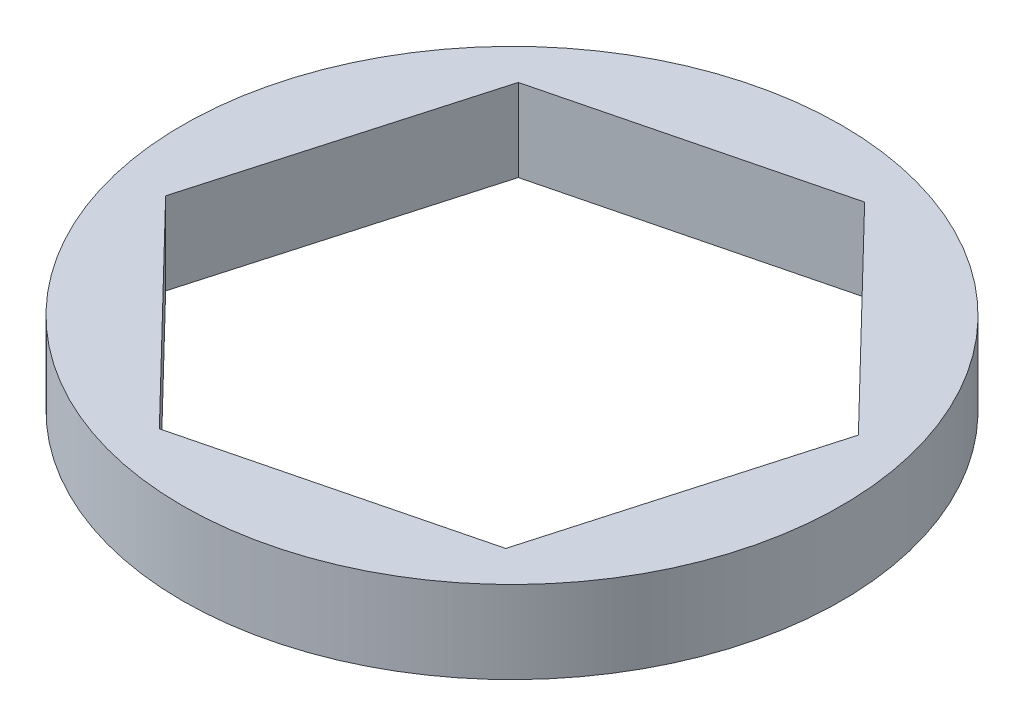
ISO-10303-21;
HEADER;
FILE_DESCRIPTION(('STEP AP214'),'2;1');
FILE_NAME('part.step','',(''),(''),'','','');
FILE_SCHEMA(('AUTOMOTIVE_DESIGN { 1 0 10303 214 1 1 1 1 }'));
ENDSEC;
DATA;
#1=APPLICATION_CONTEXT('core data for automotive mechanical design processes');
#2=APPLICATION_PROTOCOL_DEFINITION('international standard','automotive_design',2000,#1);
#3=PRODUCT_CONTEXT('',#1,'mechanical');
#4=PRODUCT('Part','Part','',(#3));
#5=PRODUCT_RELATED_PRODUCT_CATEGORY('part','',(#4));
#6=PRODUCT_DEFINITION_FORMATION('','',#4);
#7=PRODUCT_DEFINITION_CONTEXT('part definition',#1,'design');
#8=PRODUCT_DEFINITION('design','',#6,#7);
#9=PRODUCT_DEFINITION_SHAPE('','',#8);
#10=(LENGTH_UNIT() NAMED_UNIT(*) SI_UNIT(.MILLI.,.METRE.));
#11=(NAMED_UNIT(*) PLANE_ANGLE_UNIT() SI_UNIT($,.RADIAN.));
#12=(NAMED_UNIT(*) SI_UNIT($,.STERADIAN.) SOLID_ANGLE_UNIT());
#13=UNCERTAINTY_MEASURE_WITH_UNIT(LENGTH_MEASURE(1.E-05),#10,'distance_accuracy_value','');
#14=(GEOMETRIC_REPRESENTATION_CONTEXT(3) GLOBAL_UNCERTAINTY_ASSIGNED_CONTEXT((#13)) GLOBAL_UNIT_ASSIGNED_CONTEXT((#10,
#11,#12)) REPRESENTATION_CONTEXT('',''));
#15=CARTESIAN_POINT('',(0.,0.,0.));
#16=DIRECTION('',(0.,0.,1.));
#17=DIRECTION('',(1.,0.,0.));
#18=AXIS2_PLACEMENT_3D('',#15,#16,#17);
#19=CARTESIAN_POINT('',(0.,1.5875,0.));
#20=DIRECTION('',(0.,1.,0.));
#21=DIRECTION('',(0.,0.,1.));
#22=AXIS2_PLACEMENT_3D('',#19,#20,#21);
#23=PLANE('',#22);
#24=CARTESIAN_POINT('',(0.,1.5875,0.));
#25=DIRECTION('',(0.,1.,0.));
#26=DIRECTION('',(0.,0.,1.));
#27=AXIS2_PLACEMENT_3D('',#24,#25,#26);
#28=CIRCLE('',#27,6.35);
#29=CARTESIAN_POINT('',(0.,1.5875,6.35));
#30=VERTEX_POINT('',#29);
#31=EDGE_CURVE('E11',#30,#30,#28,.T.);
#32=ORIENTED_EDGE('',*,*,#31,.T.);
#33=EDGE_LOOP('',(#32));
#34=FACE_BOUND('',#33,.T.);
#35=DIRECTION('',(-0.969830096251339,0.,0.243781837726107));
#36=VECTOR('',#35,1.);
#37=CARTESIAN_POINT('',(1.50566356257848,1.5875,-5.28912584803231));
#38=LINE('',#37,#36);
#39=CARTESIAN_POINT('',(1.50566356257848,1.5875,-5.28912584803231));
#40=VERTEX_POINT('',#39);
#41=CARTESIAN_POINT('',(-3.82768556691965,1.5875,-3.9485058187617));
#42=VERTEX_POINT('',#41);
#43=EDGE_CURVE('E94',#40,#42,#38,.T.);
#44=ORIENTED_EDGE('',*,*,#43,.F.);
#45=DIRECTION('',(-0.696036312577735,0.,-0.718006581845313));
#46=VECTOR('',#45,1.);
#47=CARTESIAN_POINT('',(5.33334912949813,1.5875,-1.34062002927061));
#48=LINE('',#47,#46);
#49=CARTESIAN_POINT('',(5.33334912949813,1.5875,-1.34062002927061));
#50=VERTEX_POINT('',#49);
#51=EDGE_CURVE('E86',#50,#40,#48,.T.);
#52=ORIENTED_EDGE('',*,*,#51,.F.);
#53=DIRECTION('',(0.273793783673605,0.,-0.961788419571421));
#54=VECTOR('',#53,1.);
#55=CARTESIAN_POINT('',(3.82768556691965,1.5875,3.9485058187617));
#56=LINE('',#55,#54);
#57=CARTESIAN_POINT('',(3.82768556691965,1.5875,3.9485058187617));
#58=VERTEX_POINT('',#57);
#59=EDGE_CURVE('E114',#58,#50,#56,.T.);
#60=ORIENTED_EDGE('',*,*,#59,.F.);
#61=DIRECTION('',(0.969830096251339,0.,-0.243781837726108));
#62=VECTOR('',#61,1.);
#63=CARTESIAN_POINT('',(-1.50566356257847,1.5875,5.28912584803231));
#64=LINE('',#63,#62);
#65=CARTESIAN_POINT('',(-1.50566356257847,1.5875,5.28912584803231));
#66=VERTEX_POINT('',#65);
#67=EDGE_CURVE('E112',#66,#58,#64,.T.);
#68=ORIENTED_EDGE('',*,*,#67,.F.);
#69=DIRECTION('',(0.696036312577735,0.,0.718006581845313));
#70=VECTOR('',#69,1.);
#71=CARTESIAN_POINT('',(-5.33334912949813,1.5875,1.34062002927061));
#72=LINE('',#71,#70);
#73=CARTESIAN_POINT('',(-5.33334912949813,1.5875,1.34062002927061));
#74=VERTEX_POINT('',#73);
#75=EDGE_CURVE('E108',#74,#66,#72,.T.);
#76=ORIENTED_EDGE('',*,*,#75,.F.);
#77=DIRECTION('',(-0.273793783673604,0.,0.961788419571421));
#78=VECTOR('',#77,1.);
#79=CARTESIAN_POINT('',(-3.82768556691965,1.5875,-3.9485058187617));
#80=LINE('',#79,#78);
#81=EDGE_CURVE('E106',#42,#74,#80,.T.);
#82=ORIENTED_EDGE('',*,*,#81,.F.);
#83=EDGE_LOOP('',(#44,#52,#60,#68,#76,#82));
#84=FACE_BOUND('',#83,.T.);
#85=ADVANCED_FACE('F33',(#34,#84),#23,.T.);
#86=CARTESIAN_POINT('',(0.,0.,0.));
#87=DIRECTION('',(0.,1.,0.));
#88=DIRECTION('',(0.,0.,1.));
#89=AXIS2_PLACEMENT_3D('',#86,#87,#88);
#90=PLANE('',#89);
#91=CARTESIAN_POINT('',(0.,0.,0.));
#92=DIRECTION('',(0.,1.,0.));
#93=DIRECTION('',(0.,0.,1.));
#94=AXIS2_PLACEMENT_3D('',#91,#92,#93);
#95=CIRCLE('',#94,6.35);
#96=CARTESIAN_POINT('',(0.,0.,6.35));
#97=VERTEX_POINT('',#96);
#98=EDGE_CURVE('E37',#97,#97,#95,.T.);
#99=ORIENTED_EDGE('',*,*,#98,.F.);
#100=EDGE_LOOP('',(#99));
#101=FACE_BOUND('',#100,.T.);
#102=DIRECTION('',(-0.696036312577735,0.,-0.718006581845313));
#103=VECTOR('',#102,1.);
#104=CARTESIAN_POINT('',(5.33334912949813,0.,-1.34062002927061));
#105=LINE('',#104,#103);
#106=CARTESIAN_POINT('',(5.33334912949813,0.,-1.34062002927061));
#107=VERTEX_POINT('',#106);
#108=CARTESIAN_POINT('',(1.50566356257848,0.,-5.28912584803231));
#109=VERTEX_POINT('',#108);
#110=EDGE_CURVE('E56',#107,#109,#105,.T.);
#111=ORIENTED_EDGE('',*,*,#110,.T.);
#112=DIRECTION('',(-0.969830096251339,0.,0.243781837726107));
#113=VECTOR('',#112,1.);
#114=CARTESIAN_POINT('',(1.50566356257848,0.,-5.28912584803231));
#115=LINE('',#114,#113);
#116=CARTESIAN_POINT('',(-3.82768556691965,0.,-3.9485058187617));
#117=VERTEX_POINT('',#116);
#118=EDGE_CURVE('E101',#109,#117,#115,.T.);
#119=ORIENTED_EDGE('',*,*,#118,.T.);
#120=DIRECTION('',(-0.273793783673604,0.,0.961788419571421));
#121=VECTOR('',#120,1.);
#122=CARTESIAN_POINT('',(-3.82768556691965,0.,-3.9485058187617));
#123=LINE('',#122,#121);
#124=CARTESIAN_POINT('',(-5.33334912949813,0.,1.34062002927061));
#125=VERTEX_POINT('',#124);
#126=EDGE_CURVE('E118',#117,#125,#123,.T.);
#127=ORIENTED_EDGE('',*,*,#126,.T.);
#128=DIRECTION('',(0.696036312577735,0.,0.718006581845313));
#129=VECTOR('',#128,1.);
#130=CARTESIAN_POINT('',(-5.33334912949813,0.,1.34062002927061));
#131=LINE('',#130,#129);
#132=CARTESIAN_POINT('',(-1.50566356257847,0.,5.28912584803231));
#133=VERTEX_POINT('',#132);
#134=EDGE_CURVE('E121',#125,#133,#131,.T.);
#135=ORIENTED_EDGE('',*,*,#134,.T.);
#136=DIRECTION('',(0.969830096251339,0.,-0.243781837726108));
#137=VECTOR('',#136,1.);
#138=CARTESIAN_POINT('',(-1.50566356257847,0.,5.28912584803231));
#139=LINE('',#138,#137);
#140=CARTESIAN_POINT('',(3.82768556691965,0.,3.9485058187617));
#141=VERTEX_POINT('',#140);
#142=EDGE_CURVE('E124',#133,#141,#139,.T.);
#143=ORIENTED_EDGE('',*,*,#142,.T.);
#144=DIRECTION('',(0.273793783673605,0.,-0.961788419571421));
#145=VECTOR('',#144,1.);
#146=CARTESIAN_POINT('',(3.82768556691965,0.,3.9485058187617));
#147=LINE('',#146,#145);
#148=EDGE_CURVE('E95',#141,#107,#147,.T.);
#149=ORIENTED_EDGE('',*,*,#148,.T.);
#150=EDGE_LOOP('',(#111,#119,#127,#135,#143,#149));
#151=FACE_BOUND('',#150,.T.);
#152=ADVANCED_FACE('F141',(#101,#151),#90,.F.);
#153=CARTESIAN_POINT('',(0.,1.5875,0.));
#154=DIRECTION('',(0.,-1.,0.));
#155=DIRECTION('',(0.,0.,-1.));
#156=AXIS2_PLACEMENT_3D('',#153,#154,#155);
#157=CYLINDRICAL_SURFACE('',#156,6.35);
#158=ORIENTED_EDGE('',*,*,#31,.F.);
#159=EDGE_LOOP('',(#158));
#160=FACE_BOUND('',#159,.T.);
#161=ORIENTED_EDGE('',*,*,#98,.T.);
#162=EDGE_LOOP('',(#161));
#163=FACE_BOUND('',#162,.T.);
#164=ADVANCED_FACE('F35',(#160,#163),#157,.T.);
#165=CARTESIAN_POINT('',(5.33334912949813,1.5875,-1.34062002927061));
#166=DIRECTION('',(-0.718006581845313,0.,0.696036312577735));
#167=DIRECTION('',(0.696036312577735,0.,0.718006581845313));
#168=AXIS2_PLACEMENT_3D('',#165,#166,#167);
#169=PLANE('',#168);
#170=ORIENTED_EDGE('',*,*,#110,.F.);
#171=DIRECTION('',(0.,-1.,0.));
#172=VECTOR('',#171,1.);
#173=CARTESIAN_POINT('',(5.33334912949813,1.5875,-1.34062002927061));
#174=LINE('',#173,#172);
#175=EDGE_CURVE('E90',#50,#107,#174,.T.);
#176=ORIENTED_EDGE('',*,*,#175,.F.);
#177=ORIENTED_EDGE('',*,*,#51,.T.);
#178=DIRECTION('',(0.,-1.,0.));
#179=VECTOR('',#178,1.);
#180=CARTESIAN_POINT('',(1.50566356257848,1.5875,-5.28912584803231));
#181=LINE('',#180,#179);
#182=EDGE_CURVE('E89',#40,#109,#181,.T.);
#183=ORIENTED_EDGE('',*,*,#182,.T.);
#184=EDGE_LOOP('',(#170,#176,#177,#183));
#185=FACE_BOUND('',#184,.T.);
#186=ADVANCED_FACE('F88',(#185),#169,.T.);
#187=CARTESIAN_POINT('',(1.50566356257848,1.5875,-5.28912584803231));
#188=DIRECTION('',(0.243781837726107,0.,0.969830096251339));
#189=DIRECTION('',(0.969830096251339,0.,-0.243781837726107));
#190=AXIS2_PLACEMENT_3D('',#187,#188,#189);
#191=PLANE('',#190);
#192=ORIENTED_EDGE('',*,*,#118,.F.);
#193=ORIENTED_EDGE('',*,*,#182,.F.);
#194=ORIENTED_EDGE('',*,*,#43,.T.);
#195=DIRECTION('',(0.,-1.,0.));
#196=VECTOR('',#195,1.);
#197=CARTESIAN_POINT('',(-3.82768556691965,1.5875,-3.9485058187617));
#198=LINE('',#197,#196);
#199=EDGE_CURVE('E102',#42,#117,#198,.T.);
#200=ORIENTED_EDGE('',*,*,#199,.T.);
#201=EDGE_LOOP('',(#192,#193,#194,#200));
#202=FACE_BOUND('',#201,.T.);
#203=ADVANCED_FACE('F98',(#202),#191,.T.);
#204=CARTESIAN_POINT('',(-3.82768556691965,1.5875,-3.9485058187617));
#205=DIRECTION('',(0.961788419571421,0.,0.273793783673604));
#206=DIRECTION('',(0.273793783673604,0.,-0.961788419571421));
#207=AXIS2_PLACEMENT_3D('',#204,#205,#206);
#208=PLANE('',#207);
#209=ORIENTED_EDGE('',*,*,#126,.F.);
#210=ORIENTED_EDGE('',*,*,#199,.F.);
#211=ORIENTED_EDGE('',*,*,#81,.T.);
#212=DIRECTION('',(0.,-1.,0.));
#213=VECTOR('',#212,1.);
#214=CARTESIAN_POINT('',(-5.33334912949813,1.5875,1.34062002927061));
#215=LINE('',#214,#213);
#216=EDGE_CURVE('E133',#74,#125,#215,.T.);
#217=ORIENTED_EDGE('',*,*,#216,.T.);
#218=EDGE_LOOP('',(#209,#210,#211,#217));
#219=FACE_BOUND('',#218,.T.);
#220=ADVANCED_FACE('F137',(#219),#208,.T.);
#221=CARTESIAN_POINT('',(-5.33334912949813,1.5875,1.34062002927061));
#222=DIRECTION('',(0.718006581845313,0.,-0.696036312577735));
#223=DIRECTION('',(-0.696036312577735,0.,-0.718006581845313));
#224=AXIS2_PLACEMENT_3D('',#221,#222,#223);
#225=PLANE('',#224);
#226=ORIENTED_EDGE('',*,*,#134,.F.);
#227=ORIENTED_EDGE('',*,*,#216,.F.);
#228=ORIENTED_EDGE('',*,*,#75,.T.);
#229=DIRECTION('',(0.,-1.,0.));
#230=VECTOR('',#229,1.);
#231=CARTESIAN_POINT('',(-1.50566356257847,1.5875,5.28912584803231));
#232=LINE('',#231,#230);
#233=EDGE_CURVE('E131',#66,#133,#232,.T.);
#234=ORIENTED_EDGE('',*,*,#233,.T.);
#235=EDGE_LOOP('',(#226,#227,#228,#234));
#236=FACE_BOUND('',#235,.T.);
#237=ADVANCED_FACE('F149',(#236),#225,.T.);
#238=CARTESIAN_POINT('',(-1.50566356257847,1.5875,5.28912584803231));
#239=DIRECTION('',(-0.243781837726108,0.,-0.969830096251339));
#240=DIRECTION('',(-0.969830096251339,0.,0.243781837726108));
#241=AXIS2_PLACEMENT_3D('',#238,#239,#240);
#242=PLANE('',#241);
#243=ORIENTED_EDGE('',*,*,#142,.F.);
#244=ORIENTED_EDGE('',*,*,#233,.F.);
#245=ORIENTED_EDGE('',*,*,#67,.T.);
#246=DIRECTION('',(0.,-1.,0.));
#247=VECTOR('',#246,1.);
#248=CARTESIAN_POINT('',(3.82768556691965,1.5875,3.9485058187617));
#249=LINE('',#248,#247);
#250=EDGE_CURVE('E48',#58,#141,#249,.T.);
#251=ORIENTED_EDGE('',*,*,#250,.T.);
#252=EDGE_LOOP('',(#243,#244,#245,#251));
#253=FACE_BOUND('',#252,.T.);
#254=ADVANCED_FACE('F147',(#253),#242,.T.);
#255=CARTESIAN_POINT('',(3.82768556691965,1.5875,3.9485058187617));
#256=DIRECTION('',(-0.961788419571421,0.,-0.273793783673605));
#257=DIRECTION('',(-0.273793783673605,0.,0.961788419571421));
#258=AXIS2_PLACEMENT_3D('',#255,#256,#257);
#259=PLANE('',#258);
#260=ORIENTED_EDGE('',*,*,#148,.F.);
#261=ORIENTED_EDGE('',*,*,#250,.F.);
#262=ORIENTED_EDGE('',*,*,#59,.T.);
#263=ORIENTED_EDGE('',*,*,#175,.T.);
#264=EDGE_LOOP('',(#260,#261,#262,#263));
#265=FACE_BOUND('',#264,.T.);
#266=ADVANCED_FACE('F143',(#265),#259,.T.);
#267=CLOSED_SHELL('',(#85,#152,#164,#186,#203,#220,#237,#254,#266));
#268=MANIFOLD_SOLID_BREP('B2',#267);
#269=ADVANCED_BREP_SHAPE_REPRESENTATION('',(#18,#268),#14);
#270=SHAPE_DEFINITION_REPRESENTATION(#9,#269);
ENDSEC;
END-ISO-10303-21;
